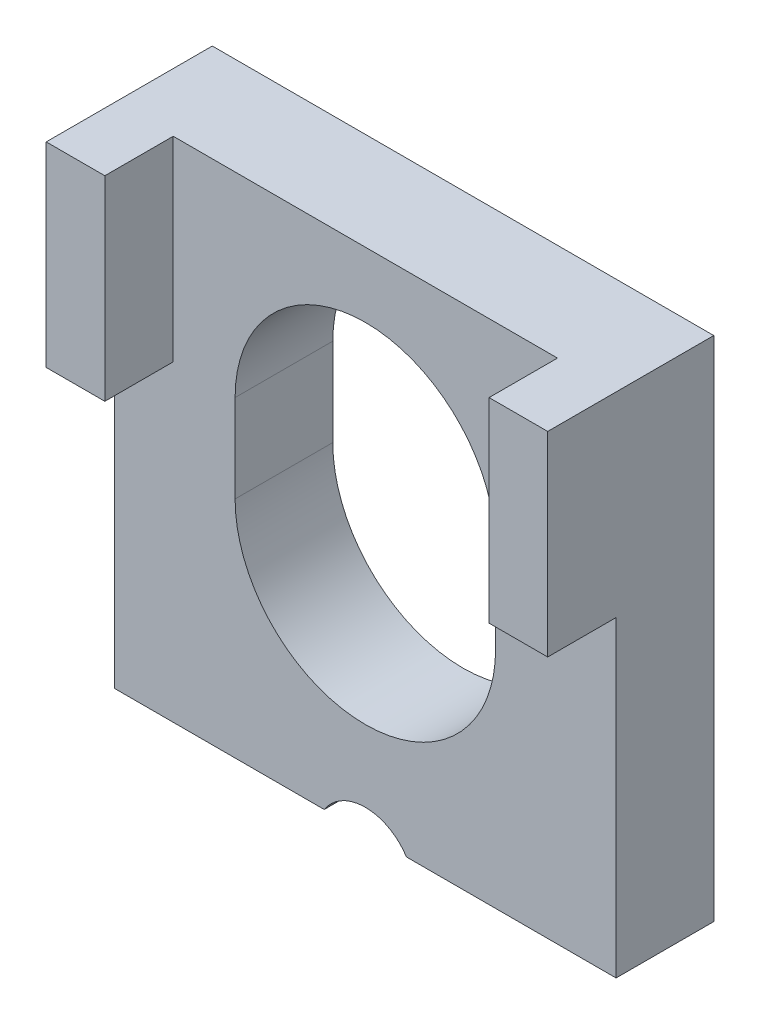
ISO-10303-21;
HEADER;
FILE_DESCRIPTION(('STEP AP214'),'2;1');
FILE_NAME('part.step','',(''),(''),'','','');
FILE_SCHEMA(('AUTOMOTIVE_DESIGN { 1 0 10303 214 1 1 1 1 }'));
ENDSEC;
DATA;
#1=APPLICATION_CONTEXT('core data for automotive mechanical design processes');
#2=APPLICATION_PROTOCOL_DEFINITION('international standard','automotive_design',2000,#1);
#3=PRODUCT_CONTEXT('',#1,'mechanical');
#4=PRODUCT('Part','Part','',(#3));
#5=PRODUCT_RELATED_PRODUCT_CATEGORY('part','',(#4));
#6=PRODUCT_DEFINITION_FORMATION('','',#4);
#7=PRODUCT_DEFINITION_CONTEXT('part definition',#1,'design');
#8=PRODUCT_DEFINITION('design','',#6,#7);
#9=PRODUCT_DEFINITION_SHAPE('','',#8);
#10=(LENGTH_UNIT() NAMED_UNIT(*) SI_UNIT(.MILLI.,.METRE.));
#11=(NAMED_UNIT(*) PLANE_ANGLE_UNIT() SI_UNIT($,.RADIAN.));
#12=(NAMED_UNIT(*) SI_UNIT($,.STERADIAN.) SOLID_ANGLE_UNIT());
#13=UNCERTAINTY_MEASURE_WITH_UNIT(LENGTH_MEASURE(1.E-05),#10,'distance_accuracy_value','');
#14=(GEOMETRIC_REPRESENTATION_CONTEXT(3) GLOBAL_UNCERTAINTY_ASSIGNED_CONTEXT((#13)) GLOBAL_UNIT_ASSIGNED_CONTEXT((#10,
#11,#12)) REPRESENTATION_CONTEXT('',''));
#15=CARTESIAN_POINT('',(0.,0.,0.));
#16=DIRECTION('',(0.,0.,1.));
#17=DIRECTION('',(1.,0.,0.));
#18=AXIS2_PLACEMENT_3D('',#15,#16,#17);
#19=CARTESIAN_POINT('',(0.,-2.65897627091936,3.));
#20=DIRECTION('',(0.,0.,-1.));
#21=DIRECTION('',(-1.,0.,0.));
#22=AXIS2_PLACEMENT_3D('',#19,#20,#21);
#23=PLANE('',#22);
#24=CARTESIAN_POINT('',(0.,7.73749960693732,3.));
#25=DIRECTION('',(0.,0.,1.));
#26=DIRECTION('',(1.,0.,0.));
#27=AXIS2_PLACEMENT_3D('',#24,#25,#26);
#28=CIRCLE('',#27,4.);
#29=CARTESIAN_POINT('',(4.,7.73749960693732,3.));
#30=VERTEX_POINT('',#29);
#31=CARTESIAN_POINT('',(-4.,7.73749960693732,3.));
#32=VERTEX_POINT('',#31);
#33=EDGE_CURVE('E211',#30,#32,#28,.T.);
#34=ORIENTED_EDGE('',*,*,#33,.F.);
#35=DIRECTION('',(0.,1.,0.));
#36=VECTOR('',#35,1.);
#37=CARTESIAN_POINT('',(4.,7.73749960693732,3.));
#38=LINE('',#37,#36);
#39=CARTESIAN_POINT('',(4.,5.04102372908064,3.));
#40=VERTEX_POINT('',#39);
#41=EDGE_CURVE('E219',#40,#30,#38,.T.);
#42=ORIENTED_EDGE('',*,*,#41,.F.);
#43=CARTESIAN_POINT('',(0.,5.04102372908064,3.));
#44=DIRECTION('',(0.,0.,1.));
#45=DIRECTION('',(1.,0.,0.));
#46=AXIS2_PLACEMENT_3D('',#43,#44,#45);
#47=CIRCLE('',#46,4.);
#48=CARTESIAN_POINT('',(-4.,5.04102372908064,3.));
#49=VERTEX_POINT('',#48);
#50=EDGE_CURVE('E216',#49,#40,#47,.T.);
#51=ORIENTED_EDGE('',*,*,#50,.F.);
#52=DIRECTION('',(0.,-1.,0.));
#53=VECTOR('',#52,1.);
#54=CARTESIAN_POINT('',(-4.,7.73749960693732,3.));
#55=LINE('',#54,#53);
#56=EDGE_CURVE('E213',#32,#49,#55,.T.);
#57=ORIENTED_EDGE('',*,*,#56,.F.);
#58=EDGE_LOOP('',(#34,#42,#51,#57));
#59=FACE_BOUND('',#58,.T.);
#60=DIRECTION('',(0.,-1.,0.));
#61=VECTOR('',#60,1.);
#62=CARTESIAN_POINT('',(5.9,13.7374996069373,3.));
#63=LINE('',#62,#61);
#64=CARTESIAN_POINT('',(5.9,13.7374996069373,3.));
#65=VERTEX_POINT('',#64);
#66=CARTESIAN_POINT('',(5.9,7.73749960693732,3.));
#67=VERTEX_POINT('',#66);
#68=EDGE_CURVE('E173',#65,#67,#63,.T.);
#69=ORIENTED_EDGE('',*,*,#68,.F.);
#70=DIRECTION('',(-1.,0.,0.));
#71=VECTOR('',#70,1.);
#72=CARTESIAN_POINT('',(-7.7,13.7374996069373,3.));
#73=LINE('',#72,#71);
#74=CARTESIAN_POINT('',(-5.9,13.7374996069373,3.));
#75=VERTEX_POINT('',#74);
#76=EDGE_CURVE('E252',#65,#75,#73,.T.);
#77=ORIENTED_EDGE('',*,*,#76,.T.);
#78=DIRECTION('',(0.,1.,0.));
#79=VECTOR('',#78,1.);
#80=CARTESIAN_POINT('',(-5.9,13.7374996069373,3.));
#81=LINE('',#80,#79);
#82=CARTESIAN_POINT('',(-5.9,7.73749960693732,3.));
#83=VERTEX_POINT('',#82);
#84=EDGE_CURVE('E190',#83,#75,#81,.T.);
#85=ORIENTED_EDGE('',*,*,#84,.F.);
#86=DIRECTION('',(1.,0.,0.));
#87=VECTOR('',#86,1.);
#88=CARTESIAN_POINT('',(-7.7,7.73749960693732,3.));
#89=LINE('',#88,#87);
#90=CARTESIAN_POINT('',(-7.7,7.73749960693732,3.));
#91=VERTEX_POINT('',#90);
#92=EDGE_CURVE('E185',#91,#83,#89,.T.);
#93=ORIENTED_EDGE('',*,*,#92,.F.);
#94=DIRECTION('',(0.,-1.,0.));
#95=VECTOR('',#94,1.);
#96=CARTESIAN_POINT('',(-7.7,13.7374996069373,3.));
#97=LINE('',#96,#95);
#98=CARTESIAN_POINT('',(-7.7,-1.84922937682936,3.));
#99=VERTEX_POINT('',#98);
#100=EDGE_CURVE('E242',#91,#99,#97,.T.);
#101=ORIENTED_EDGE('',*,*,#100,.T.);
#102=DIRECTION('',(1.,0.,0.));
#103=VECTOR('',#102,1.);
#104=CARTESIAN_POINT('',(-7.7,-1.84922937682936,3.));
#105=LINE('',#104,#103);
#106=CARTESIAN_POINT('',(-1.26265987800025,-1.84922937682936,3.));
#107=VERTEX_POINT('',#106);
#108=EDGE_CURVE('E244',#99,#107,#105,.T.);
#109=ORIENTED_EDGE('',*,*,#108,.T.);
#110=CARTESIAN_POINT('',(0.,-2.65897627091936,3.));
#111=DIRECTION('',(0.,0.,-1.));
#112=DIRECTION('',(-1.,0.,0.));
#113=AXIS2_PLACEMENT_3D('',#110,#111,#112);
#114=CIRCLE('',#113,1.5);
#115=CARTESIAN_POINT('',(1.26265987800025,-1.84922937682937,3.));
#116=VERTEX_POINT('',#115);
#117=EDGE_CURVE('E247',#107,#116,#114,.T.);
#118=ORIENTED_EDGE('',*,*,#117,.T.);
#119=DIRECTION('',(1.,0.,0.));
#120=VECTOR('',#119,1.);
#121=CARTESIAN_POINT('',(7.7,-1.84922937682936,3.));
#122=LINE('',#121,#120);
#123=CARTESIAN_POINT('',(7.7,-1.84922937682936,3.));
#124=VERTEX_POINT('',#123);
#125=EDGE_CURVE('E249',#116,#124,#122,.T.);
#126=ORIENTED_EDGE('',*,*,#125,.T.);
#127=DIRECTION('',(0.,1.,0.));
#128=VECTOR('',#127,1.);
#129=CARTESIAN_POINT('',(7.7,-0.0396047922675049,3.));
#130=LINE('',#129,#128);
#131=CARTESIAN_POINT('',(7.7,7.73749960693732,3.));
#132=VERTEX_POINT('',#131);
#133=EDGE_CURVE('E53',#124,#132,#130,.T.);
#134=ORIENTED_EDGE('',*,*,#133,.T.);
#135=DIRECTION('',(1.,0.,0.));
#136=VECTOR('',#135,1.);
#137=CARTESIAN_POINT('',(7.7,7.73749960693732,3.));
#138=LINE('',#137,#136);
#139=EDGE_CURVE('E48',#67,#132,#138,.T.);
#140=ORIENTED_EDGE('',*,*,#139,.F.);
#141=EDGE_LOOP('',(#69,#77,#85,#93,#101,#109,#118,#126,#134,#140));
#142=FACE_BOUND('',#141,.T.);
#143=ADVANCED_FACE('F33',(#59,#142),#23,.F.);
#144=CARTESIAN_POINT('',(0.,-2.65897627091936,0.));
#145=DIRECTION('',(0.,0.,-1.));
#146=DIRECTION('',(-1.,0.,0.));
#147=AXIS2_PLACEMENT_3D('',#144,#145,#146);
#148=PLANE('',#147);
#149=DIRECTION('',(0.,-1.,0.));
#150=VECTOR('',#149,1.);
#151=CARTESIAN_POINT('',(-7.7,-0.0396047922675089,0.));
#152=LINE('',#151,#150);
#153=CARTESIAN_POINT('',(-7.7,13.7374996069373,0.));
#154=VERTEX_POINT('',#153);
#155=CARTESIAN_POINT('',(-7.7,-1.84922937682936,0.));
#156=VERTEX_POINT('',#155);
#157=EDGE_CURVE('E241',#154,#156,#152,.T.);
#158=ORIENTED_EDGE('',*,*,#157,.F.);
#159=DIRECTION('',(-1.,0.,0.));
#160=VECTOR('',#159,1.);
#161=CARTESIAN_POINT('',(-7.7,13.7374996069373,0.));
#162=LINE('',#161,#160);
#163=CARTESIAN_POINT('',(7.7,13.7374996069373,0.));
#164=VERTEX_POINT('',#163);
#165=EDGE_CURVE('E245',#164,#154,#162,.T.);
#166=ORIENTED_EDGE('',*,*,#165,.F.);
#167=DIRECTION('',(0.,1.,0.));
#168=VECTOR('',#167,1.);
#169=CARTESIAN_POINT('',(7.7,13.7374996069373,0.));
#170=LINE('',#169,#168);
#171=CARTESIAN_POINT('',(7.7,-1.84922937682936,0.));
#172=VERTEX_POINT('',#171);
#173=EDGE_CURVE('E152',#172,#164,#170,.T.);
#174=ORIENTED_EDGE('',*,*,#173,.F.);
#175=DIRECTION('',(1.,0.,0.));
#176=VECTOR('',#175,1.);
#177=CARTESIAN_POINT('',(7.7,-1.84922937682936,0.));
#178=LINE('',#177,#176);
#179=CARTESIAN_POINT('',(1.26265987800025,-1.84922937682937,0.));
#180=VERTEX_POINT('',#179);
#181=EDGE_CURVE('E259',#180,#172,#178,.T.);
#182=ORIENTED_EDGE('',*,*,#181,.F.);
#183=CARTESIAN_POINT('',(0.,-2.65897627091936,0.));
#184=DIRECTION('',(0.,0.,-1.));
#185=DIRECTION('',(-1.,0.,0.));
#186=AXIS2_PLACEMENT_3D('',#183,#184,#185);
#187=CIRCLE('',#186,1.5);
#188=CARTESIAN_POINT('',(-1.26265987800025,-1.84922937682936,0.));
#189=VERTEX_POINT('',#188);
#190=EDGE_CURVE('E257',#189,#180,#187,.T.);
#191=ORIENTED_EDGE('',*,*,#190,.F.);
#192=DIRECTION('',(1.,0.,0.));
#193=VECTOR('',#192,1.);
#194=CARTESIAN_POINT('',(-7.7,-1.84922937682936,0.));
#195=LINE('',#194,#193);
#196=EDGE_CURVE('E255',#156,#189,#195,.T.);
#197=ORIENTED_EDGE('',*,*,#196,.F.);
#198=EDGE_LOOP('',(#158,#166,#174,#182,#191,#197));
#199=FACE_BOUND('',#198,.T.);
#200=DIRECTION('',(0.,1.,0.));
#201=VECTOR('',#200,1.);
#202=CARTESIAN_POINT('',(4.,7.73749960693732,0.));
#203=LINE('',#202,#201);
#204=CARTESIAN_POINT('',(4.,5.04102372908064,0.));
#205=VERTEX_POINT('',#204);
#206=CARTESIAN_POINT('',(4.,7.73749960693732,0.));
#207=VERTEX_POINT('',#206);
#208=EDGE_CURVE('E214',#205,#207,#203,.T.);
#209=ORIENTED_EDGE('',*,*,#208,.T.);
#210=CARTESIAN_POINT('',(0.,7.73749960693732,0.));
#211=DIRECTION('',(0.,0.,1.));
#212=DIRECTION('',(1.,0.,0.));
#213=AXIS2_PLACEMENT_3D('',#210,#211,#212);
#214=CIRCLE('',#213,4.);
#215=CARTESIAN_POINT('',(-4.,7.73749960693732,0.));
#216=VERTEX_POINT('',#215);
#217=EDGE_CURVE('E210',#207,#216,#214,.T.);
#218=ORIENTED_EDGE('',*,*,#217,.T.);
#219=DIRECTION('',(0.,-1.,0.));
#220=VECTOR('',#219,1.);
#221=CARTESIAN_POINT('',(-4.,7.73749960693732,0.));
#222=LINE('',#221,#220);
#223=CARTESIAN_POINT('',(-4.,5.04102372908064,0.));
#224=VERTEX_POINT('',#223);
#225=EDGE_CURVE('E224',#216,#224,#222,.T.);
#226=ORIENTED_EDGE('',*,*,#225,.T.);
#227=CARTESIAN_POINT('',(0.,5.04102372908064,0.));
#228=DIRECTION('',(0.,0.,1.));
#229=DIRECTION('',(1.,0.,0.));
#230=AXIS2_PLACEMENT_3D('',#227,#228,#229);
#231=CIRCLE('',#230,4.);
#232=EDGE_CURVE('E227',#224,#205,#231,.T.);
#233=ORIENTED_EDGE('',*,*,#232,.T.);
#234=EDGE_LOOP('',(#209,#218,#226,#233));
#235=FACE_BOUND('',#234,.T.);
#236=ADVANCED_FACE('F281',(#199,#235),#148,.T.);
#237=CARTESIAN_POINT('',(-7.7,-0.0396047922675089,3.));
#238=DIRECTION('',(1.,0.,0.));
#239=DIRECTION('',(0.,0.,-1.));
#240=AXIS2_PLACEMENT_3D('',#237,#238,#239);
#241=PLANE('',#240);
#242=ORIENTED_EDGE('',*,*,#157,.T.);
#243=DIRECTION('',(0.,0.,-1.));
#244=VECTOR('',#243,1.);
#245=CARTESIAN_POINT('',(-7.7,-1.84922937682936,3.));
#246=LINE('',#245,#244);
#247=EDGE_CURVE('E11',#99,#156,#246,.T.);
#248=ORIENTED_EDGE('',*,*,#247,.F.);
#249=ORIENTED_EDGE('',*,*,#100,.F.);
#250=DIRECTION('',(0.,0.,-1.));
#251=VECTOR('',#250,1.);
#252=CARTESIAN_POINT('',(-7.7,7.73749960693732,5.1));
#253=LINE('',#252,#251);
#254=CARTESIAN_POINT('',(-7.7,7.73749960693732,5.1));
#255=VERTEX_POINT('',#254);
#256=EDGE_CURVE('E207',#255,#91,#253,.T.);
#257=ORIENTED_EDGE('',*,*,#256,.F.);
#258=DIRECTION('',(0.,-1.,0.));
#259=VECTOR('',#258,1.);
#260=CARTESIAN_POINT('',(-7.7,13.7374996069373,5.1));
#261=LINE('',#260,#259);
#262=CARTESIAN_POINT('',(-7.7,13.7374996069373,5.1));
#263=VERTEX_POINT('',#262);
#264=EDGE_CURVE('E186',#263,#255,#261,.T.);
#265=ORIENTED_EDGE('',*,*,#264,.F.);
#266=DIRECTION('',(0.,0.,-1.));
#267=VECTOR('',#266,1.);
#268=CARTESIAN_POINT('',(-7.7,13.7374996069373,3.));
#269=LINE('',#268,#267);
#270=EDGE_CURVE('E157',#263,#154,#269,.T.);
#271=ORIENTED_EDGE('',*,*,#270,.T.);
#272=EDGE_LOOP('',(#242,#248,#249,#257,#265,#271));
#273=FACE_BOUND('',#272,.T.);
#274=ADVANCED_FACE('F35',(#273),#241,.F.);
#275=CARTESIAN_POINT('',(-7.7,-1.84922937682936,3.));
#276=DIRECTION('',(0.,1.,0.));
#277=DIRECTION('',(0.,0.,1.));
#278=AXIS2_PLACEMENT_3D('',#275,#276,#277);
#279=PLANE('',#278);
#280=ORIENTED_EDGE('',*,*,#196,.T.);
#281=DIRECTION('',(0.,0.,-1.));
#282=VECTOR('',#281,1.);
#283=CARTESIAN_POINT('',(-1.26265987800025,-1.84922937682936,3.));
#284=LINE('',#283,#282);
#285=EDGE_CURVE('E41',#107,#189,#284,.T.);
#286=ORIENTED_EDGE('',*,*,#285,.F.);
#287=ORIENTED_EDGE('',*,*,#108,.F.);
#288=ORIENTED_EDGE('',*,*,#247,.T.);
#289=EDGE_LOOP('',(#280,#286,#287,#288));
#290=FACE_BOUND('',#289,.T.);
#291=ADVANCED_FACE('F307',(#290),#279,.F.);
#292=CARTESIAN_POINT('',(0.,-2.65897627091936,3.));
#293=DIRECTION('',(0.,0.,-1.));
#294=DIRECTION('',(-1.,0.,0.));
#295=AXIS2_PLACEMENT_3D('',#292,#293,#294);
#296=CYLINDRICAL_SURFACE('',#295,1.5);
#297=ORIENTED_EDGE('',*,*,#190,.T.);
#298=DIRECTION('',(0.,0.,-1.));
#299=VECTOR('',#298,1.);
#300=CARTESIAN_POINT('',(1.26265987800025,-1.84922937682937,3.));
#301=LINE('',#300,#299);
#302=EDGE_CURVE('E267',#116,#180,#301,.T.);
#303=ORIENTED_EDGE('',*,*,#302,.F.);
#304=ORIENTED_EDGE('',*,*,#117,.F.);
#305=ORIENTED_EDGE('',*,*,#285,.T.);
#306=EDGE_LOOP('',(#297,#303,#304,#305));
#307=FACE_BOUND('',#306,.T.);
#308=ADVANCED_FACE('F274',(#307),#296,.F.);
#309=CARTESIAN_POINT('',(7.7,-1.84922937682936,3.));
#310=DIRECTION('',(0.,1.,0.));
#311=DIRECTION('',(-1.,0.,0.));
#312=AXIS2_PLACEMENT_3D('',#309,#310,#311);
#313=PLANE('',#312);
#314=ORIENTED_EDGE('',*,*,#181,.T.);
#315=DIRECTION('',(0.,0.,-1.));
#316=VECTOR('',#315,1.);
#317=CARTESIAN_POINT('',(7.7,-1.84922937682936,3.));
#318=LINE('',#317,#316);
#319=EDGE_CURVE('E156',#124,#172,#318,.T.);
#320=ORIENTED_EDGE('',*,*,#319,.F.);
#321=ORIENTED_EDGE('',*,*,#125,.F.);
#322=ORIENTED_EDGE('',*,*,#302,.T.);
#323=EDGE_LOOP('',(#314,#320,#321,#322));
#324=FACE_BOUND('',#323,.T.);
#325=ADVANCED_FACE('F285',(#324),#313,.F.);
#326=CARTESIAN_POINT('',(7.7,13.7374996069373,3.));
#327=DIRECTION('',(-1.,0.,0.));
#328=DIRECTION('',(0.,-1.,0.));
#329=AXIS2_PLACEMENT_3D('',#326,#327,#328);
#330=PLANE('',#329);
#331=ORIENTED_EDGE('',*,*,#173,.T.);
#332=DIRECTION('',(0.,0.,-1.));
#333=VECTOR('',#332,1.);
#334=CARTESIAN_POINT('',(7.7,13.7374996069373,3.));
#335=LINE('',#334,#333);
#336=CARTESIAN_POINT('',(7.7,13.7374996069373,5.1));
#337=VERTEX_POINT('',#336);
#338=EDGE_CURVE('E145',#337,#164,#335,.T.);
#339=ORIENTED_EDGE('',*,*,#338,.F.);
#340=DIRECTION('',(0.,1.,0.));
#341=VECTOR('',#340,1.);
#342=CARTESIAN_POINT('',(7.7,13.7374996069373,5.1));
#343=LINE('',#342,#341);
#344=CARTESIAN_POINT('',(7.7,7.73749960693732,5.1));
#345=VERTEX_POINT('',#344);
#346=EDGE_CURVE('E150',#345,#337,#343,.T.);
#347=ORIENTED_EDGE('',*,*,#346,.F.);
#348=DIRECTION('',(0.,0.,-1.));
#349=VECTOR('',#348,1.);
#350=CARTESIAN_POINT('',(7.7,7.73749960693732,5.1));
#351=LINE('',#350,#349);
#352=EDGE_CURVE('E178',#345,#132,#351,.T.);
#353=ORIENTED_EDGE('',*,*,#352,.T.);
#354=ORIENTED_EDGE('',*,*,#133,.F.);
#355=ORIENTED_EDGE('',*,*,#319,.T.);
#356=EDGE_LOOP('',(#331,#339,#347,#353,#354,#355));
#357=FACE_BOUND('',#356,.T.);
#358=ADVANCED_FACE('F147',(#357),#330,.F.);
#359=CARTESIAN_POINT('',(-7.7,13.7374996069373,3.));
#360=DIRECTION('',(0.,-1.,0.));
#361=DIRECTION('',(0.,0.,-1.));
#362=AXIS2_PLACEMENT_3D('',#359,#360,#361);
#363=PLANE('',#362);
#364=ORIENTED_EDGE('',*,*,#165,.T.);
#365=ORIENTED_EDGE('',*,*,#270,.F.);
#366=DIRECTION('',(-1.,0.,0.));
#367=VECTOR('',#366,1.);
#368=CARTESIAN_POINT('',(-7.7,13.7374996069373,5.1));
#369=LINE('',#368,#367);
#370=CARTESIAN_POINT('',(-5.9,13.7374996069373,5.1));
#371=VERTEX_POINT('',#370);
#372=EDGE_CURVE('E194',#371,#263,#369,.T.);
#373=ORIENTED_EDGE('',*,*,#372,.F.);
#374=DIRECTION('',(0.,0.,-1.));
#375=VECTOR('',#374,1.);
#376=CARTESIAN_POINT('',(-5.9,13.7374996069373,5.1));
#377=LINE('',#376,#375);
#378=EDGE_CURVE('E197',#371,#75,#377,.T.);
#379=ORIENTED_EDGE('',*,*,#378,.T.);
#380=ORIENTED_EDGE('',*,*,#76,.F.);
#381=DIRECTION('',(0.,0.,-1.));
#382=VECTOR('',#381,1.);
#383=CARTESIAN_POINT('',(5.9,13.7374996069373,5.1));
#384=LINE('',#383,#382);
#385=CARTESIAN_POINT('',(5.9,13.7374996069373,5.1));
#386=VERTEX_POINT('',#385);
#387=EDGE_CURVE('E163',#386,#65,#384,.T.);
#388=ORIENTED_EDGE('',*,*,#387,.F.);
#389=DIRECTION('',(-1.,0.,0.));
#390=VECTOR('',#389,1.);
#391=CARTESIAN_POINT('',(7.7,13.7374996069373,5.1));
#392=LINE('',#391,#390);
#393=EDGE_CURVE('E160',#337,#386,#392,.T.);
#394=ORIENTED_EDGE('',*,*,#393,.F.);
#395=ORIENTED_EDGE('',*,*,#338,.T.);
#396=EDGE_LOOP('',(#364,#365,#373,#379,#380,#388,#394,#395));
#397=FACE_BOUND('',#396,.T.);
#398=ADVANCED_FACE('F161',(#397),#363,.F.);
#399=CARTESIAN_POINT('',(0.,7.73749960693732,3.));
#400=DIRECTION('',(0.,0.,-1.));
#401=DIRECTION('',(-1.,0.,0.));
#402=AXIS2_PLACEMENT_3D('',#399,#400,#401);
#403=CYLINDRICAL_SURFACE('',#402,4.);
#404=ORIENTED_EDGE('',*,*,#217,.F.);
#405=DIRECTION('',(0.,0.,-1.));
#406=VECTOR('',#405,1.);
#407=CARTESIAN_POINT('',(4.,7.73749960693732,3.));
#408=LINE('',#407,#406);
#409=EDGE_CURVE('E221',#30,#207,#408,.T.);
#410=ORIENTED_EDGE('',*,*,#409,.F.);
#411=ORIENTED_EDGE('',*,*,#33,.T.);
#412=DIRECTION('',(0.,0.,-1.));
#413=VECTOR('',#412,1.);
#414=CARTESIAN_POINT('',(-4.,7.73749960693732,3.));
#415=LINE('',#414,#413);
#416=EDGE_CURVE('E238',#32,#216,#415,.T.);
#417=ORIENTED_EDGE('',*,*,#416,.T.);
#418=EDGE_LOOP('',(#404,#410,#411,#417));
#419=FACE_BOUND('',#418,.T.);
#420=ADVANCED_FACE('F323',(#419),#403,.F.);
#421=CARTESIAN_POINT('',(-4.,7.73749960693732,3.));
#422=DIRECTION('',(1.,0.,0.));
#423=DIRECTION('',(0.,1.,0.));
#424=AXIS2_PLACEMENT_3D('',#421,#422,#423);
#425=PLANE('',#424);
#426=ORIENTED_EDGE('',*,*,#225,.F.);
#427=ORIENTED_EDGE('',*,*,#416,.F.);
#428=ORIENTED_EDGE('',*,*,#56,.T.);
#429=DIRECTION('',(0.,0.,-1.));
#430=VECTOR('',#429,1.);
#431=CARTESIAN_POINT('',(-4.,5.04102372908064,3.));
#432=LINE('',#431,#430);
#433=EDGE_CURVE('E236',#49,#224,#432,.T.);
#434=ORIENTED_EDGE('',*,*,#433,.T.);
#435=EDGE_LOOP('',(#426,#427,#428,#434));
#436=FACE_BOUND('',#435,.T.);
#437=ADVANCED_FACE('F351',(#436),#425,.T.);
#438=CARTESIAN_POINT('',(0.,5.04102372908064,3.));
#439=DIRECTION('',(0.,0.,-1.));
#440=DIRECTION('',(-1.,0.,0.));
#441=AXIS2_PLACEMENT_3D('',#438,#439,#440);
#442=CYLINDRICAL_SURFACE('',#441,4.);
#443=ORIENTED_EDGE('',*,*,#232,.F.);
#444=ORIENTED_EDGE('',*,*,#433,.F.);
#445=ORIENTED_EDGE('',*,*,#50,.T.);
#446=DIRECTION('',(0.,0.,-1.));
#447=VECTOR('',#446,1.);
#448=CARTESIAN_POINT('',(4.,5.04102372908064,3.));
#449=LINE('',#448,#447);
#450=EDGE_CURVE('E234',#40,#205,#449,.T.);
#451=ORIENTED_EDGE('',*,*,#450,.T.);
#452=EDGE_LOOP('',(#443,#444,#445,#451));
#453=FACE_BOUND('',#452,.T.);
#454=ADVANCED_FACE('F358',(#453),#442,.F.);
#455=CARTESIAN_POINT('',(4.,7.73749960693732,3.));
#456=DIRECTION('',(-1.,0.,0.));
#457=DIRECTION('',(0.,-1.,0.));
#458=AXIS2_PLACEMENT_3D('',#455,#456,#457);
#459=PLANE('',#458);
#460=ORIENTED_EDGE('',*,*,#208,.F.);
#461=ORIENTED_EDGE('',*,*,#450,.F.);
#462=ORIENTED_EDGE('',*,*,#41,.T.);
#463=ORIENTED_EDGE('',*,*,#409,.T.);
#464=EDGE_LOOP('',(#460,#461,#462,#463));
#465=FACE_BOUND('',#464,.T.);
#466=ADVANCED_FACE('F365',(#465),#459,.T.);
#467=CARTESIAN_POINT('',(-7.7,7.73749960693732,5.1));
#468=DIRECTION('',(0.,1.,0.));
#469=DIRECTION('',(0.,0.,1.));
#470=AXIS2_PLACEMENT_3D('',#467,#468,#469);
#471=PLANE('',#470);
#472=ORIENTED_EDGE('',*,*,#92,.T.);
#473=DIRECTION('',(0.,0.,-1.));
#474=VECTOR('',#473,1.);
#475=CARTESIAN_POINT('',(-5.9,7.73749960693732,5.1));
#476=LINE('',#475,#474);
#477=CARTESIAN_POINT('',(-5.9,7.73749960693732,5.1));
#478=VERTEX_POINT('',#477);
#479=EDGE_CURVE('E204',#478,#83,#476,.T.);
#480=ORIENTED_EDGE('',*,*,#479,.F.);
#481=DIRECTION('',(1.,0.,0.));
#482=VECTOR('',#481,1.);
#483=CARTESIAN_POINT('',(-7.7,7.73749960693732,5.1));
#484=LINE('',#483,#482);
#485=EDGE_CURVE('E189',#255,#478,#484,.T.);
#486=ORIENTED_EDGE('',*,*,#485,.F.);
#487=ORIENTED_EDGE('',*,*,#256,.T.);
#488=EDGE_LOOP('',(#472,#480,#486,#487));
#489=FACE_BOUND('',#488,.T.);
#490=ADVANCED_FACE('F306',(#489),#471,.F.);
#491=CARTESIAN_POINT('',(-5.9,13.7374996069373,5.1));
#492=DIRECTION('',(-1.,0.,0.));
#493=DIRECTION('',(0.,-1.,0.));
#494=AXIS2_PLACEMENT_3D('',#491,#492,#493);
#495=PLANE('',#494);
#496=ORIENTED_EDGE('',*,*,#84,.T.);
#497=ORIENTED_EDGE('',*,*,#378,.F.);
#498=DIRECTION('',(0.,1.,0.));
#499=VECTOR('',#498,1.);
#500=CARTESIAN_POINT('',(-5.9,13.7374996069373,5.1));
#501=LINE('',#500,#499);
#502=EDGE_CURVE('E192',#478,#371,#501,.T.);
#503=ORIENTED_EDGE('',*,*,#502,.F.);
#504=ORIENTED_EDGE('',*,*,#479,.T.);
#505=EDGE_LOOP('',(#496,#497,#503,#504));
#506=FACE_BOUND('',#505,.T.);
#507=ADVANCED_FACE('F294',(#506),#495,.F.);
#508=CARTESIAN_POINT('',(0.,0.,5.1));
#509=DIRECTION('',(0.,0.,1.));
#510=DIRECTION('',(1.,0.,0.));
#511=AXIS2_PLACEMENT_3D('',#508,#509,#510);
#512=PLANE('',#511);
#513=ORIENTED_EDGE('',*,*,#264,.T.);
#514=ORIENTED_EDGE('',*,*,#485,.T.);
#515=ORIENTED_EDGE('',*,*,#502,.T.);
#516=ORIENTED_EDGE('',*,*,#372,.T.);
#517=EDGE_LOOP('',(#513,#514,#515,#516));
#518=FACE_BOUND('',#517,.T.);
#519=ADVANCED_FACE('F300',(#518),#512,.T.);
#520=CARTESIAN_POINT('',(5.9,13.7374996069373,5.1));
#521=DIRECTION('',(1.,0.,0.));
#522=DIRECTION('',(0.,1.,0.));
#523=AXIS2_PLACEMENT_3D('',#520,#521,#522);
#524=PLANE('',#523);
#525=ORIENTED_EDGE('',*,*,#68,.T.);
#526=DIRECTION('',(0.,0.,-1.));
#527=VECTOR('',#526,1.);
#528=CARTESIAN_POINT('',(5.9,7.73749960693732,5.1));
#529=LINE('',#528,#527);
#530=CARTESIAN_POINT('',(5.9,7.73749960693732,5.1));
#531=VERTEX_POINT('',#530);
#532=EDGE_CURVE('E181',#531,#67,#529,.T.);
#533=ORIENTED_EDGE('',*,*,#532,.F.);
#534=DIRECTION('',(0.,-1.,0.));
#535=VECTOR('',#534,1.);
#536=CARTESIAN_POINT('',(5.9,13.7374996069373,5.1));
#537=LINE('',#536,#535);
#538=EDGE_CURVE('E166',#386,#531,#537,.T.);
#539=ORIENTED_EDGE('',*,*,#538,.F.);
#540=ORIENTED_EDGE('',*,*,#387,.T.);
#541=EDGE_LOOP('',(#525,#533,#539,#540));
#542=FACE_BOUND('',#541,.T.);
#543=ADVANCED_FACE('F291',(#542),#524,.F.);
#544=CARTESIAN_POINT('',(7.7,7.73749960693732,5.1));
#545=DIRECTION('',(0.,1.,0.));
#546=DIRECTION('',(0.,0.,1.));
#547=AXIS2_PLACEMENT_3D('',#544,#545,#546);
#548=PLANE('',#547);
#549=ORIENTED_EDGE('',*,*,#139,.T.);
#550=ORIENTED_EDGE('',*,*,#352,.F.);
#551=DIRECTION('',(1.,0.,0.));
#552=VECTOR('',#551,1.);
#553=CARTESIAN_POINT('',(7.7,7.73749960693732,5.1));
#554=LINE('',#553,#552);
#555=EDGE_CURVE('E170',#531,#345,#554,.T.);
#556=ORIENTED_EDGE('',*,*,#555,.F.);
#557=ORIENTED_EDGE('',*,*,#532,.T.);
#558=EDGE_LOOP('',(#549,#550,#556,#557));
#559=FACE_BOUND('',#558,.T.);
#560=ADVANCED_FACE('F288',(#559),#548,.F.);
#561=CARTESIAN_POINT('',(0.,0.,5.1));
#562=DIRECTION('',(0.,0.,-1.));
#563=DIRECTION('',(-1.,0.,0.));
#564=AXIS2_PLACEMENT_3D('',#561,#562,#563);
#565=PLANE('',#564);
#566=ORIENTED_EDGE('',*,*,#346,.T.);
#567=ORIENTED_EDGE('',*,*,#393,.T.);
#568=ORIENTED_EDGE('',*,*,#538,.T.);
#569=ORIENTED_EDGE('',*,*,#555,.T.);
#570=EDGE_LOOP('',(#566,#567,#568,#569));
#571=FACE_BOUND('',#570,.T.);
#572=ADVANCED_FACE('F168',(#571),#565,.F.);
#573=CLOSED_SHELL('',(#143,#236,#274,#291,#308,#325,#358,#398,#420,#437,#454,#466,#490,#507,
#519,#543,#560,#572));
#574=MANIFOLD_SOLID_BREP('B2',#573);
#575=ADVANCED_BREP_SHAPE_REPRESENTATION('',(#18,#574),#14);
#576=SHAPE_DEFINITION_REPRESENTATION(#9,#575);
ENDSEC;
END-ISO-10303-21;
